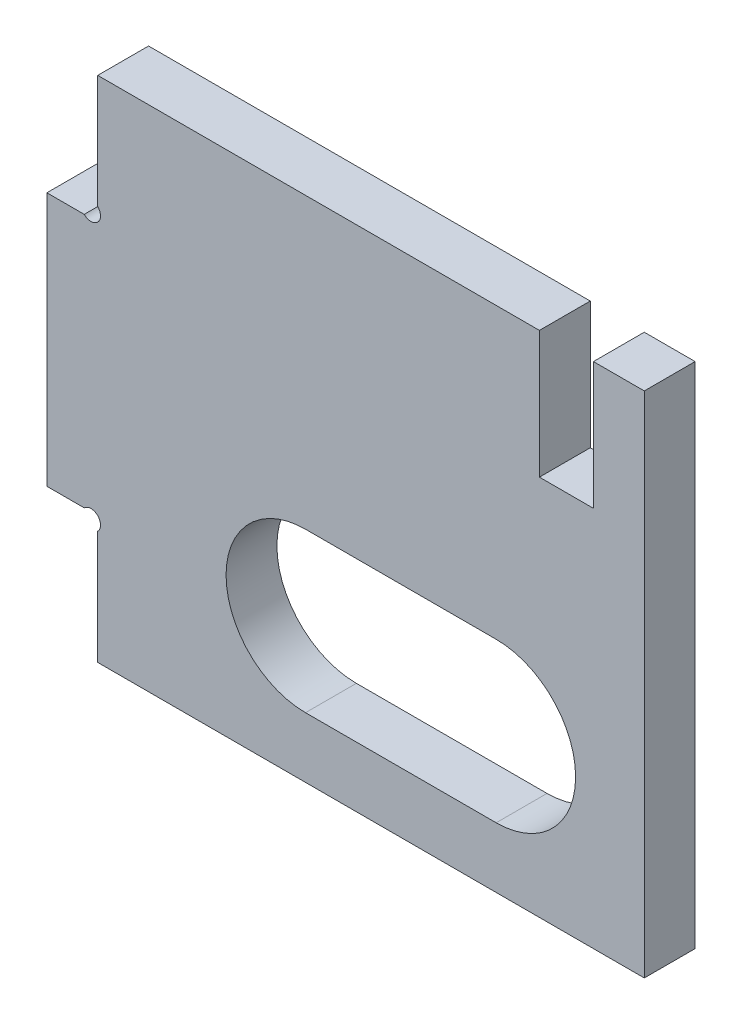
ISO-10303-21;
HEADER;
FILE_DESCRIPTION(('STEP AP214'),'2;1');
FILE_NAME('part.step','',(''),(''),'','','');
FILE_SCHEMA(('AUTOMOTIVE_DESIGN { 1 0 10303 214 1 1 1 1 }'));
ENDSEC;
DATA;
#1=APPLICATION_CONTEXT('core data for automotive mechanical design processes');
#2=APPLICATION_PROTOCOL_DEFINITION('international standard','automotive_design',2000,#1);
#3=PRODUCT_CONTEXT('',#1,'mechanical');
#4=PRODUCT('Part','Part','',(#3));
#5=PRODUCT_RELATED_PRODUCT_CATEGORY('part','',(#4));
#6=PRODUCT_DEFINITION_FORMATION('','',#4);
#7=PRODUCT_DEFINITION_CONTEXT('part definition',#1,'design');
#8=PRODUCT_DEFINITION('design','',#6,#7);
#9=PRODUCT_DEFINITION_SHAPE('','',#8);
#10=(LENGTH_UNIT() NAMED_UNIT(*) SI_UNIT(.MILLI.,.METRE.));
#11=(NAMED_UNIT(*) PLANE_ANGLE_UNIT() SI_UNIT($,.RADIAN.));
#12=(NAMED_UNIT(*) SI_UNIT($,.STERADIAN.) SOLID_ANGLE_UNIT());
#13=UNCERTAINTY_MEASURE_WITH_UNIT(LENGTH_MEASURE(1.E-05),#10,'distance_accuracy_value','');
#14=(GEOMETRIC_REPRESENTATION_CONTEXT(3) GLOBAL_UNCERTAINTY_ASSIGNED_CONTEXT((#13)) GLOBAL_UNIT_ASSIGNED_CONTEXT((#10,
#11,#12)) REPRESENTATION_CONTEXT('',''));
#15=CARTESIAN_POINT('',(0.,0.,0.));
#16=DIRECTION('',(0.,0.,1.));
#17=DIRECTION('',(1.,0.,0.));
#18=AXIS2_PLACEMENT_3D('',#15,#16,#17);
#19=CARTESIAN_POINT('',(-49.266922557395,51.6318844514959,8.));
#20=DIRECTION('',(0.,0.,1.));
#21=DIRECTION('',(1.,0.,0.));
#22=AXIS2_PLACEMENT_3D('',#19,#20,#21);
#23=PLANE('',#22);
#24=DIRECTION('',(-1.,0.,0.));
#25=VECTOR('',#24,1.);
#26=CARTESIAN_POINT('',(21.2937376143848,70.5712242797161,8.));
#27=LINE('',#26,#25);
#28=CARTESIAN_POINT('',(21.2937376143848,70.5712242797161,8.));
#29=VERTEX_POINT('',#28);
#30=CARTESIAN_POINT('',(-48.2062623856152,70.5712242797161,8.));
#31=VERTEX_POINT('',#30);
#32=EDGE_CURVE('E193',#29,#31,#27,.T.);
#33=ORIENTED_EDGE('',*,*,#32,.T.);
#34=DIRECTION('',(0.,-1.,0.));
#35=VECTOR('',#34,1.);
#36=CARTESIAN_POINT('',(-48.2062623856152,70.5712242797161,8.));
#37=LINE('',#36,#35);
#38=CARTESIAN_POINT('',(-48.2062623856152,52.6925446232758,8.));
#39=VERTEX_POINT('',#38);
#40=EDGE_CURVE('E196',#31,#39,#37,.T.);
#41=ORIENTED_EDGE('',*,*,#40,.T.);
#42=CARTESIAN_POINT('',(-49.266922557395,51.6318844514959,8.));
#43=DIRECTION('',(0.,0.,-1.));
#44=DIRECTION('',(1.,0.,0.));
#45=AXIS2_PLACEMENT_3D('',#42,#43,#44);
#46=CIRCLE('',#45,1.5);
#47=CARTESIAN_POINT('',(-50.3275827291749,50.5712242797161,8.));
#48=VERTEX_POINT('',#47);
#49=EDGE_CURVE('E199',#39,#48,#46,.T.);
#50=ORIENTED_EDGE('',*,*,#49,.T.);
#51=DIRECTION('',(-1.,0.,0.));
#52=VECTOR('',#51,1.);
#53=CARTESIAN_POINT('',(-50.3275827291749,50.5712242797161,8.));
#54=LINE('',#53,#52);
#55=CARTESIAN_POINT('',(-56.2062623856152,50.5712242797161,8.));
#56=VERTEX_POINT('',#55);
#57=EDGE_CURVE('E201',#48,#56,#54,.T.);
#58=ORIENTED_EDGE('',*,*,#57,.T.);
#59=DIRECTION('',(0.,-1.,0.));
#60=VECTOR('',#59,1.);
#61=CARTESIAN_POINT('',(-56.2062623856152,50.5712242797161,8.));
#62=LINE('',#61,#60);
#63=CARTESIAN_POINT('',(-56.2062623856152,10.5712242797161,8.));
#64=VERTEX_POINT('',#63);
#65=EDGE_CURVE('E203',#56,#64,#62,.T.);
#66=ORIENTED_EDGE('',*,*,#65,.T.);
#67=DIRECTION('',(1.,0.,0.));
#68=VECTOR('',#67,1.);
#69=CARTESIAN_POINT('',(-56.2062623856152,10.5712242797161,8.));
#70=LINE('',#69,#68);
#71=CARTESIAN_POINT('',(-50.3275827291748,10.5712242797161,8.));
#72=VERTEX_POINT('',#71);
#73=EDGE_CURVE('E205',#64,#72,#70,.T.);
#74=ORIENTED_EDGE('',*,*,#73,.T.);
#75=CARTESIAN_POINT('',(-49.266922557395,9.51056410793631,8.));
#76=DIRECTION('',(0.,0.,-1.));
#77=DIRECTION('',(1.,0.,0.));
#78=AXIS2_PLACEMENT_3D('',#75,#76,#77);
#79=CIRCLE('',#78,1.5);
#80=CARTESIAN_POINT('',(-48.2062623856152,8.44990393615645,8.));
#81=VERTEX_POINT('',#80);
#82=EDGE_CURVE('E207',#72,#81,#79,.T.);
#83=ORIENTED_EDGE('',*,*,#82,.T.);
#84=DIRECTION('',(0.,-1.,0.));
#85=VECTOR('',#84,1.);
#86=CARTESIAN_POINT('',(-48.2062623856152,8.44990393615646,8.));
#87=LINE('',#86,#85);
#88=CARTESIAN_POINT('',(-48.2062623856152,-9.42877572028391,8.));
#89=VERTEX_POINT('',#88);
#90=EDGE_CURVE('E209',#81,#89,#87,.T.);
#91=ORIENTED_EDGE('',*,*,#90,.T.);
#92=DIRECTION('',(1.,0.,0.));
#93=VECTOR('',#92,1.);
#94=CARTESIAN_POINT('',(-48.2062623856152,-9.42877572028391,8.));
#95=LINE('',#94,#93);
#96=CARTESIAN_POINT('',(37.7937376143848,-9.42877572028391,8.));
#97=VERTEX_POINT('',#96);
#98=EDGE_CURVE('E211',#89,#97,#95,.T.);
#99=ORIENTED_EDGE('',*,*,#98,.T.);
#100=DIRECTION('',(0.,1.,0.));
#101=VECTOR('',#100,1.);
#102=CARTESIAN_POINT('',(37.7937376143848,-9.42877572028391,8.));
#103=LINE('',#102,#101);
#104=CARTESIAN_POINT('',(37.7937376143848,70.5712242797161,8.));
#105=VERTEX_POINT('',#104);
#106=EDGE_CURVE('E213',#97,#105,#103,.T.);
#107=ORIENTED_EDGE('',*,*,#106,.T.);
#108=DIRECTION('',(-1.,0.,0.));
#109=VECTOR('',#108,1.);
#110=CARTESIAN_POINT('',(37.7937376143848,70.5712242797161,8.));
#111=LINE('',#110,#109);
#112=CARTESIAN_POINT('',(29.7937376143848,70.5712242797161,8.));
#113=VERTEX_POINT('',#112);
#114=EDGE_CURVE('E215',#105,#113,#111,.T.);
#115=ORIENTED_EDGE('',*,*,#114,.T.);
#116=DIRECTION('',(0.,-1.,0.));
#117=VECTOR('',#116,1.);
#118=CARTESIAN_POINT('',(29.7937376143848,70.5712242797161,8.));
#119=LINE('',#118,#117);
#120=CARTESIAN_POINT('',(29.7937376143848,50.5712242797161,8.));
#121=VERTEX_POINT('',#120);
#122=EDGE_CURVE('E217',#113,#121,#119,.T.);
#123=ORIENTED_EDGE('',*,*,#122,.T.);
#124=DIRECTION('',(-1.,0.,0.));
#125=VECTOR('',#124,1.);
#126=CARTESIAN_POINT('',(29.7937376143848,50.5712242797161,8.));
#127=LINE('',#126,#125);
#128=CARTESIAN_POINT('',(21.2937376143848,50.5712242797161,8.));
#129=VERTEX_POINT('',#128);
#130=EDGE_CURVE('E219',#121,#129,#127,.T.);
#131=ORIENTED_EDGE('',*,*,#130,.T.);
#132=DIRECTION('',(0.,1.,0.));
#133=VECTOR('',#132,1.);
#134=CARTESIAN_POINT('',(21.2937376143848,50.5712242797161,8.));
#135=LINE('',#134,#133);
#136=EDGE_CURVE('E221',#129,#29,#135,.T.);
#137=ORIENTED_EDGE('',*,*,#136,.T.);
#138=EDGE_LOOP('',(#33,#41,#50,#58,#66,#74,#83,#91,#99,#107,#115,#123,#131,#137));
#139=FACE_BOUND('',#138,.T.);
#140=DIRECTION('',(1.,0.,0.));
#141=VECTOR('',#140,1.);
#142=CARTESIAN_POINT('',(-15.511163156441,0.0712242797160818,8.));
#143=LINE('',#142,#141);
#144=CARTESIAN_POINT('',(-15.511163156441,0.0712242797160818,8.));
#145=VERTEX_POINT('',#144);
#146=CARTESIAN_POINT('',(14.488836843559,0.0712242797160957,8.));
#147=VERTEX_POINT('',#146);
#148=EDGE_CURVE('E165',#145,#147,#143,.T.);
#149=ORIENTED_EDGE('',*,*,#148,.F.);
#150=CARTESIAN_POINT('',(-15.511163156441,12.5712242797161,8.));
#151=DIRECTION('',(0.,0.,1.));
#152=DIRECTION('',(1.,0.,0.));
#153=AXIS2_PLACEMENT_3D('',#150,#151,#152);
#154=CIRCLE('',#153,12.5);
#155=CARTESIAN_POINT('',(-15.511163156441,25.0712242797161,8.));
#156=VERTEX_POINT('',#155);
#157=EDGE_CURVE('E157',#156,#145,#154,.T.);
#158=ORIENTED_EDGE('',*,*,#157,.F.);
#159=DIRECTION('',(-1.,0.,0.));
#160=VECTOR('',#159,1.);
#161=CARTESIAN_POINT('',(-15.511163156441,25.0712242797161,8.));
#162=LINE('',#161,#160);
#163=CARTESIAN_POINT('',(14.488836843559,25.0712242797161,8.));
#164=VERTEX_POINT('',#163);
#165=EDGE_CURVE('E179',#164,#156,#162,.T.);
#166=ORIENTED_EDGE('',*,*,#165,.F.);
#167=CARTESIAN_POINT('',(14.488836843559,12.5712242797161,8.));
#168=DIRECTION('',(0.,0.,1.));
#169=DIRECTION('',(1.,0.,0.));
#170=AXIS2_PLACEMENT_3D('',#167,#168,#169);
#171=CIRCLE('',#170,12.5);
#172=EDGE_CURVE('E177',#147,#164,#171,.T.);
#173=ORIENTED_EDGE('',*,*,#172,.F.);
#174=EDGE_LOOP('',(#149,#158,#166,#173));
#175=FACE_BOUND('',#174,.T.);
#176=ADVANCED_FACE('F32',(#139,#175),#23,.T.);
#177=CARTESIAN_POINT('',(-49.266922557395,51.6318844514959,0.));
#178=DIRECTION('',(0.,0.,1.));
#179=DIRECTION('',(1.,0.,0.));
#180=AXIS2_PLACEMENT_3D('',#177,#178,#179);
#181=PLANE('',#180);
#182=DIRECTION('',(-1.,0.,0.));
#183=VECTOR('',#182,1.);
#184=CARTESIAN_POINT('',(21.2937376143848,70.5712242797161,0.));
#185=LINE('',#184,#183);
#186=CARTESIAN_POINT('',(21.2937376143848,70.5712242797161,0.));
#187=VERTEX_POINT('',#186);
#188=CARTESIAN_POINT('',(-48.2062623856152,70.5712242797161,0.));
#189=VERTEX_POINT('',#188);
#190=EDGE_CURVE('E173',#187,#189,#185,.T.);
#191=ORIENTED_EDGE('',*,*,#190,.F.);
#192=DIRECTION('',(0.,1.,0.));
#193=VECTOR('',#192,1.);
#194=CARTESIAN_POINT('',(21.2937376143848,50.5712242797161,0.));
#195=LINE('',#194,#193);
#196=CARTESIAN_POINT('',(21.2937376143848,50.5712242797161,0.));
#197=VERTEX_POINT('',#196);
#198=EDGE_CURVE('E197',#197,#187,#195,.T.);
#199=ORIENTED_EDGE('',*,*,#198,.F.);
#200=DIRECTION('',(-1.,0.,0.));
#201=VECTOR('',#200,1.);
#202=CARTESIAN_POINT('',(29.7937376143848,50.5712242797161,0.));
#203=LINE('',#202,#201);
#204=CARTESIAN_POINT('',(29.7937376143848,50.5712242797161,0.));
#205=VERTEX_POINT('',#204);
#206=EDGE_CURVE('E248',#205,#197,#203,.T.);
#207=ORIENTED_EDGE('',*,*,#206,.F.);
#208=DIRECTION('',(0.,-1.,0.));
#209=VECTOR('',#208,1.);
#210=CARTESIAN_POINT('',(29.7937376143848,70.5712242797161,0.));
#211=LINE('',#210,#209);
#212=CARTESIAN_POINT('',(29.7937376143848,70.5712242797161,0.));
#213=VERTEX_POINT('',#212);
#214=EDGE_CURVE('E246',#213,#205,#211,.T.);
#215=ORIENTED_EDGE('',*,*,#214,.F.);
#216=DIRECTION('',(-1.,0.,0.));
#217=VECTOR('',#216,1.);
#218=CARTESIAN_POINT('',(37.7937376143848,70.5712242797161,0.));
#219=LINE('',#218,#217);
#220=CARTESIAN_POINT('',(37.7937376143848,70.5712242797161,0.));
#221=VERTEX_POINT('',#220);
#222=EDGE_CURVE('E244',#221,#213,#219,.T.);
#223=ORIENTED_EDGE('',*,*,#222,.F.);
#224=DIRECTION('',(0.,1.,0.));
#225=VECTOR('',#224,1.);
#226=CARTESIAN_POINT('',(37.7937376143848,-9.42877572028391,0.));
#227=LINE('',#226,#225);
#228=CARTESIAN_POINT('',(37.7937376143848,-9.42877572028391,0.));
#229=VERTEX_POINT('',#228);
#230=EDGE_CURVE('E242',#229,#221,#227,.T.);
#231=ORIENTED_EDGE('',*,*,#230,.F.);
#232=DIRECTION('',(1.,0.,0.));
#233=VECTOR('',#232,1.);
#234=CARTESIAN_POINT('',(-48.2062623856152,-9.42877572028391,0.));
#235=LINE('',#234,#233);
#236=CARTESIAN_POINT('',(-48.2062623856152,-9.42877572028391,0.));
#237=VERTEX_POINT('',#236);
#238=EDGE_CURVE('E240',#237,#229,#235,.T.);
#239=ORIENTED_EDGE('',*,*,#238,.F.);
#240=DIRECTION('',(0.,-1.,0.));
#241=VECTOR('',#240,1.);
#242=CARTESIAN_POINT('',(-48.2062623856152,8.44990393615646,0.));
#243=LINE('',#242,#241);
#244=CARTESIAN_POINT('',(-48.2062623856152,8.44990393615645,0.));
#245=VERTEX_POINT('',#244);
#246=EDGE_CURVE('E238',#245,#237,#243,.T.);
#247=ORIENTED_EDGE('',*,*,#246,.F.);
#248=CARTESIAN_POINT('',(-49.266922557395,9.51056410793631,0.));
#249=DIRECTION('',(0.,0.,-1.));
#250=DIRECTION('',(1.,0.,0.));
#251=AXIS2_PLACEMENT_3D('',#248,#249,#250);
#252=CIRCLE('',#251,1.5);
#253=CARTESIAN_POINT('',(-50.3275827291748,10.5712242797161,0.));
#254=VERTEX_POINT('',#253);
#255=EDGE_CURVE('E236',#254,#245,#252,.T.);
#256=ORIENTED_EDGE('',*,*,#255,.F.);
#257=DIRECTION('',(1.,0.,0.));
#258=VECTOR('',#257,1.);
#259=CARTESIAN_POINT('',(-56.2062623856152,10.5712242797161,0.));
#260=LINE('',#259,#258);
#261=CARTESIAN_POINT('',(-56.2062623856152,10.5712242797161,0.));
#262=VERTEX_POINT('',#261);
#263=EDGE_CURVE('E234',#262,#254,#260,.T.);
#264=ORIENTED_EDGE('',*,*,#263,.F.);
#265=DIRECTION('',(0.,-1.,0.));
#266=VECTOR('',#265,1.);
#267=CARTESIAN_POINT('',(-56.2062623856152,50.5712242797161,0.));
#268=LINE('',#267,#266);
#269=CARTESIAN_POINT('',(-56.2062623856152,50.5712242797161,0.));
#270=VERTEX_POINT('',#269);
#271=EDGE_CURVE('E232',#270,#262,#268,.T.);
#272=ORIENTED_EDGE('',*,*,#271,.F.);
#273=DIRECTION('',(-1.,0.,0.));
#274=VECTOR('',#273,1.);
#275=CARTESIAN_POINT('',(-50.3275827291749,50.5712242797161,0.));
#276=LINE('',#275,#274);
#277=CARTESIAN_POINT('',(-50.3275827291749,50.5712242797161,0.));
#278=VERTEX_POINT('',#277);
#279=EDGE_CURVE('E230',#278,#270,#276,.T.);
#280=ORIENTED_EDGE('',*,*,#279,.F.);
#281=CARTESIAN_POINT('',(-49.266922557395,51.6318844514959,0.));
#282=DIRECTION('',(0.,0.,-1.));
#283=DIRECTION('',(1.,0.,0.));
#284=AXIS2_PLACEMENT_3D('',#281,#282,#283);
#285=CIRCLE('',#284,1.5);
#286=CARTESIAN_POINT('',(-48.2062623856152,52.6925446232758,0.));
#287=VERTEX_POINT('',#286);
#288=EDGE_CURVE('E228',#287,#278,#285,.T.);
#289=ORIENTED_EDGE('',*,*,#288,.F.);
#290=DIRECTION('',(0.,-1.,0.));
#291=VECTOR('',#290,1.);
#292=CARTESIAN_POINT('',(-48.2062623856152,70.5712242797161,0.));
#293=LINE('',#292,#291);
#294=EDGE_CURVE('E226',#189,#287,#293,.T.);
#295=ORIENTED_EDGE('',*,*,#294,.F.);
#296=EDGE_LOOP('',(#191,#199,#207,#215,#223,#231,#239,#247,#256,#264,#272,#280,#289,#295));
#297=FACE_BOUND('',#296,.T.);
#298=CARTESIAN_POINT('',(-15.511163156441,12.5712242797161,0.));
#299=DIRECTION('',(0.,0.,1.));
#300=DIRECTION('',(1.,0.,0.));
#301=AXIS2_PLACEMENT_3D('',#298,#299,#300);
#302=CIRCLE('',#301,12.5);
#303=CARTESIAN_POINT('',(-15.511163156441,25.0712242797161,0.));
#304=VERTEX_POINT('',#303);
#305=CARTESIAN_POINT('',(-15.511163156441,0.0712242797160818,0.));
#306=VERTEX_POINT('',#305);
#307=EDGE_CURVE('E55',#304,#306,#302,.T.);
#308=ORIENTED_EDGE('',*,*,#307,.T.);
#309=DIRECTION('',(1.,0.,0.));
#310=VECTOR('',#309,1.);
#311=CARTESIAN_POINT('',(-15.511163156441,0.0712242797160818,0.));
#312=LINE('',#311,#310);
#313=CARTESIAN_POINT('',(14.488836843559,0.0712242797160957,0.));
#314=VERTEX_POINT('',#313);
#315=EDGE_CURVE('E172',#306,#314,#312,.T.);
#316=ORIENTED_EDGE('',*,*,#315,.T.);
#317=CARTESIAN_POINT('',(14.488836843559,12.5712242797161,0.));
#318=DIRECTION('',(0.,0.,1.));
#319=DIRECTION('',(1.,0.,0.));
#320=AXIS2_PLACEMENT_3D('',#317,#318,#319);
#321=CIRCLE('',#320,12.5);
#322=CARTESIAN_POINT('',(14.488836843559,25.0712242797161,0.));
#323=VERTEX_POINT('',#322);
#324=EDGE_CURVE('E185',#314,#323,#321,.T.);
#325=ORIENTED_EDGE('',*,*,#324,.T.);
#326=DIRECTION('',(-1.,0.,0.));
#327=VECTOR('',#326,1.);
#328=CARTESIAN_POINT('',(-15.511163156441,25.0712242797161,0.));
#329=LINE('',#328,#327);
#330=EDGE_CURVE('E166',#323,#304,#329,.T.);
#331=ORIENTED_EDGE('',*,*,#330,.T.);
#332=EDGE_LOOP('',(#308,#316,#325,#331));
#333=FACE_BOUND('',#332,.T.);
#334=ADVANCED_FACE('F296',(#297,#333),#181,.F.);
#335=CARTESIAN_POINT('',(21.2937376143848,70.5712242797161,8.));
#336=DIRECTION('',(0.,-1.,0.));
#337=DIRECTION('',(1.,0.,0.));
#338=AXIS2_PLACEMENT_3D('',#335,#336,#337);
#339=PLANE('',#338);
#340=ORIENTED_EDGE('',*,*,#190,.T.);
#341=DIRECTION('',(0.,0.,-1.));
#342=VECTOR('',#341,1.);
#343=CARTESIAN_POINT('',(-48.2062623856152,70.5712242797161,8.));
#344=LINE('',#343,#342);
#345=EDGE_CURVE('E11',#31,#189,#344,.T.);
#346=ORIENTED_EDGE('',*,*,#345,.F.);
#347=ORIENTED_EDGE('',*,*,#32,.F.);
#348=DIRECTION('',(0.,0.,-1.));
#349=VECTOR('',#348,1.);
#350=CARTESIAN_POINT('',(21.2937376143848,70.5712242797161,8.));
#351=LINE('',#350,#349);
#352=EDGE_CURVE('E223',#29,#187,#351,.T.);
#353=ORIENTED_EDGE('',*,*,#352,.T.);
#354=EDGE_LOOP('',(#340,#346,#347,#353));
#355=FACE_BOUND('',#354,.T.);
#356=ADVANCED_FACE('F34',(#355),#339,.F.);
#357=CARTESIAN_POINT('',(-48.2062623856152,70.5712242797161,8.));
#358=DIRECTION('',(1.,0.,0.));
#359=DIRECTION('',(0.,1.,0.));
#360=AXIS2_PLACEMENT_3D('',#357,#358,#359);
#361=PLANE('',#360);
#362=ORIENTED_EDGE('',*,*,#294,.T.);
#363=DIRECTION('',(0.,0.,-1.));
#364=VECTOR('',#363,1.);
#365=CARTESIAN_POINT('',(-48.2062623856152,52.6925446232758,8.));
#366=LINE('',#365,#364);
#367=EDGE_CURVE('E40',#39,#287,#366,.T.);
#368=ORIENTED_EDGE('',*,*,#367,.F.);
#369=ORIENTED_EDGE('',*,*,#40,.F.);
#370=ORIENTED_EDGE('',*,*,#345,.T.);
#371=EDGE_LOOP('',(#362,#368,#369,#370));
#372=FACE_BOUND('',#371,.T.);
#373=ADVANCED_FACE('F313',(#372),#361,.F.);
#374=CARTESIAN_POINT('',(-49.266922557395,51.6318844514959,8.));
#375=DIRECTION('',(0.,0.,-1.));
#376=DIRECTION('',(-1.,0.,0.));
#377=AXIS2_PLACEMENT_3D('',#374,#375,#376);
#378=CYLINDRICAL_SURFACE('',#377,1.5);
#379=ORIENTED_EDGE('',*,*,#288,.T.);
#380=DIRECTION('',(0.,0.,-1.));
#381=VECTOR('',#380,1.);
#382=CARTESIAN_POINT('',(-50.3275827291749,50.5712242797161,8.));
#383=LINE('',#382,#381);
#384=EDGE_CURVE('E283',#48,#278,#383,.T.);
#385=ORIENTED_EDGE('',*,*,#384,.F.);
#386=ORIENTED_EDGE('',*,*,#49,.F.);
#387=ORIENTED_EDGE('',*,*,#367,.T.);
#388=EDGE_LOOP('',(#379,#385,#386,#387));
#389=FACE_BOUND('',#388,.T.);
#390=ADVANCED_FACE('F290',(#389),#378,.F.);
#391=CARTESIAN_POINT('',(-50.3275827291749,50.5712242797161,8.));
#392=DIRECTION('',(0.,-1.,0.));
#393=DIRECTION('',(0.,0.,-1.));
#394=AXIS2_PLACEMENT_3D('',#391,#392,#393);
#395=PLANE('',#394);
#396=ORIENTED_EDGE('',*,*,#279,.T.);
#397=DIRECTION('',(0.,0.,-1.));
#398=VECTOR('',#397,1.);
#399=CARTESIAN_POINT('',(-56.2062623856152,50.5712242797161,8.));
#400=LINE('',#399,#398);
#401=EDGE_CURVE('E280',#56,#270,#400,.T.);
#402=ORIENTED_EDGE('',*,*,#401,.F.);
#403=ORIENTED_EDGE('',*,*,#57,.F.);
#404=ORIENTED_EDGE('',*,*,#384,.T.);
#405=EDGE_LOOP('',(#396,#402,#403,#404));
#406=FACE_BOUND('',#405,.T.);
#407=ADVANCED_FACE('F302',(#406),#395,.F.);
#408=CARTESIAN_POINT('',(-56.2062623856152,50.5712242797161,8.));
#409=DIRECTION('',(1.,0.,0.));
#410=DIRECTION('',(0.,1.,0.));
#411=AXIS2_PLACEMENT_3D('',#408,#409,#410);
#412=PLANE('',#411);
#413=ORIENTED_EDGE('',*,*,#271,.T.);
#414=DIRECTION('',(0.,0.,-1.));
#415=VECTOR('',#414,1.);
#416=CARTESIAN_POINT('',(-56.2062623856152,10.5712242797161,8.));
#417=LINE('',#416,#415);
#418=EDGE_CURVE('E277',#64,#262,#417,.T.);
#419=ORIENTED_EDGE('',*,*,#418,.F.);
#420=ORIENTED_EDGE('',*,*,#65,.F.);
#421=ORIENTED_EDGE('',*,*,#401,.T.);
#422=EDGE_LOOP('',(#413,#419,#420,#421));
#423=FACE_BOUND('',#422,.T.);
#424=ADVANCED_FACE('F306',(#423),#412,.F.);
#425=CARTESIAN_POINT('',(-56.2062623856152,10.5712242797161,8.));
#426=DIRECTION('',(0.,1.,0.));
#427=DIRECTION('',(0.,0.,1.));
#428=AXIS2_PLACEMENT_3D('',#425,#426,#427);
#429=PLANE('',#428);
#430=ORIENTED_EDGE('',*,*,#263,.T.);
#431=DIRECTION('',(0.,0.,-1.));
#432=VECTOR('',#431,1.);
#433=CARTESIAN_POINT('',(-50.3275827291748,10.5712242797161,8.));
#434=LINE('',#433,#432);
#435=EDGE_CURVE('E274',#72,#254,#434,.T.);
#436=ORIENTED_EDGE('',*,*,#435,.F.);
#437=ORIENTED_EDGE('',*,*,#73,.F.);
#438=ORIENTED_EDGE('',*,*,#418,.T.);
#439=EDGE_LOOP('',(#430,#436,#437,#438));
#440=FACE_BOUND('',#439,.T.);
#441=ADVANCED_FACE('F356',(#440),#429,.F.);
#442=CARTESIAN_POINT('',(-49.266922557395,9.51056410793631,8.));
#443=DIRECTION('',(0.,0.,-1.));
#444=DIRECTION('',(-1.,0.,0.));
#445=AXIS2_PLACEMENT_3D('',#442,#443,#444);
#446=CYLINDRICAL_SURFACE('',#445,1.5);
#447=ORIENTED_EDGE('',*,*,#255,.T.);
#448=DIRECTION('',(0.,0.,-1.));
#449=VECTOR('',#448,1.);
#450=CARTESIAN_POINT('',(-48.2062623856152,8.44990393615645,8.));
#451=LINE('',#450,#449);
#452=EDGE_CURVE('E271',#81,#245,#451,.T.);
#453=ORIENTED_EDGE('',*,*,#452,.F.);
#454=ORIENTED_EDGE('',*,*,#82,.F.);
#455=ORIENTED_EDGE('',*,*,#435,.T.);
#456=EDGE_LOOP('',(#447,#453,#454,#455));
#457=FACE_BOUND('',#456,.T.);
#458=ADVANCED_FACE('F354',(#457),#446,.F.);
#459=CARTESIAN_POINT('',(-48.2062623856152,8.44990393615646,8.));
#460=DIRECTION('',(1.,0.,0.));
#461=DIRECTION('',(0.,0.,-1.));
#462=AXIS2_PLACEMENT_3D('',#459,#460,#461);
#463=PLANE('',#462);
#464=ORIENTED_EDGE('',*,*,#246,.T.);
#465=DIRECTION('',(0.,0.,-1.));
#466=VECTOR('',#465,1.);
#467=CARTESIAN_POINT('',(-48.2062623856152,-9.42877572028391,8.));
#468=LINE('',#467,#466);
#469=EDGE_CURVE('E268',#89,#237,#468,.T.);
#470=ORIENTED_EDGE('',*,*,#469,.F.);
#471=ORIENTED_EDGE('',*,*,#90,.F.);
#472=ORIENTED_EDGE('',*,*,#452,.T.);
#473=EDGE_LOOP('',(#464,#470,#471,#472));
#474=FACE_BOUND('',#473,.T.);
#475=ADVANCED_FACE('F349',(#474),#463,.F.);
#476=CARTESIAN_POINT('',(-48.2062623856152,-9.42877572028391,8.));
#477=DIRECTION('',(0.,1.,0.));
#478=DIRECTION('',(0.,0.,1.));
#479=AXIS2_PLACEMENT_3D('',#476,#477,#478);
#480=PLANE('',#479);
#481=ORIENTED_EDGE('',*,*,#238,.T.);
#482=DIRECTION('',(0.,0.,-1.));
#483=VECTOR('',#482,1.);
#484=CARTESIAN_POINT('',(37.7937376143848,-9.42877572028391,8.));
#485=LINE('',#484,#483);
#486=EDGE_CURVE('E265',#97,#229,#485,.T.);
#487=ORIENTED_EDGE('',*,*,#486,.F.);
#488=ORIENTED_EDGE('',*,*,#98,.F.);
#489=ORIENTED_EDGE('',*,*,#469,.T.);
#490=EDGE_LOOP('',(#481,#487,#488,#489));
#491=FACE_BOUND('',#490,.T.);
#492=ADVANCED_FACE('F344',(#491),#480,.F.);
#493=CARTESIAN_POINT('',(37.7937376143848,-9.42877572028391,8.));
#494=DIRECTION('',(-1.,0.,0.));
#495=DIRECTION('',(0.,0.,1.));
#496=AXIS2_PLACEMENT_3D('',#493,#494,#495);
#497=PLANE('',#496);
#498=ORIENTED_EDGE('',*,*,#230,.T.);
#499=DIRECTION('',(0.,0.,-1.));
#500=VECTOR('',#499,1.);
#501=CARTESIAN_POINT('',(37.7937376143848,70.5712242797161,8.));
#502=LINE('',#501,#500);
#503=EDGE_CURVE('E262',#105,#221,#502,.T.);
#504=ORIENTED_EDGE('',*,*,#503,.F.);
#505=ORIENTED_EDGE('',*,*,#106,.F.);
#506=ORIENTED_EDGE('',*,*,#486,.T.);
#507=EDGE_LOOP('',(#498,#504,#505,#506));
#508=FACE_BOUND('',#507,.T.);
#509=ADVANCED_FACE('F340',(#508),#497,.F.);
#510=CARTESIAN_POINT('',(37.7937376143848,70.5712242797161,8.));
#511=DIRECTION('',(0.,-1.,0.));
#512=DIRECTION('',(1.,0.,0.));
#513=AXIS2_PLACEMENT_3D('',#510,#511,#512);
#514=PLANE('',#513);
#515=ORIENTED_EDGE('',*,*,#222,.T.);
#516=DIRECTION('',(0.,0.,-1.));
#517=VECTOR('',#516,1.);
#518=CARTESIAN_POINT('',(29.7937376143848,70.5712242797161,8.));
#519=LINE('',#518,#517);
#520=EDGE_CURVE('E259',#113,#213,#519,.T.);
#521=ORIENTED_EDGE('',*,*,#520,.F.);
#522=ORIENTED_EDGE('',*,*,#114,.F.);
#523=ORIENTED_EDGE('',*,*,#503,.T.);
#524=EDGE_LOOP('',(#515,#521,#522,#523));
#525=FACE_BOUND('',#524,.T.);
#526=ADVANCED_FACE('F335',(#525),#514,.F.);
#527=CARTESIAN_POINT('',(29.7937376143848,70.5712242797161,8.));
#528=DIRECTION('',(1.,0.,0.));
#529=DIRECTION('',(0.,1.,0.));
#530=AXIS2_PLACEMENT_3D('',#527,#528,#529);
#531=PLANE('',#530);
#532=ORIENTED_EDGE('',*,*,#214,.T.);
#533=DIRECTION('',(0.,0.,-1.));
#534=VECTOR('',#533,1.);
#535=CARTESIAN_POINT('',(29.7937376143848,50.5712242797161,8.));
#536=LINE('',#535,#534);
#537=EDGE_CURVE('E256',#121,#205,#536,.T.);
#538=ORIENTED_EDGE('',*,*,#537,.F.);
#539=ORIENTED_EDGE('',*,*,#122,.F.);
#540=ORIENTED_EDGE('',*,*,#520,.T.);
#541=EDGE_LOOP('',(#532,#538,#539,#540));
#542=FACE_BOUND('',#541,.T.);
#543=ADVANCED_FACE('F329',(#542),#531,.F.);
#544=CARTESIAN_POINT('',(29.7937376143848,50.5712242797161,8.));
#545=DIRECTION('',(0.,-1.,0.));
#546=DIRECTION('',(1.,0.,0.));
#547=AXIS2_PLACEMENT_3D('',#544,#545,#546);
#548=PLANE('',#547);
#549=ORIENTED_EDGE('',*,*,#206,.T.);
#550=DIRECTION('',(0.,0.,-1.));
#551=VECTOR('',#550,1.);
#552=CARTESIAN_POINT('',(21.2937376143848,50.5712242797161,8.));
#553=LINE('',#552,#551);
#554=EDGE_CURVE('E253',#129,#197,#553,.T.);
#555=ORIENTED_EDGE('',*,*,#554,.F.);
#556=ORIENTED_EDGE('',*,*,#130,.F.);
#557=ORIENTED_EDGE('',*,*,#537,.T.);
#558=EDGE_LOOP('',(#549,#555,#556,#557));
#559=FACE_BOUND('',#558,.T.);
#560=ADVANCED_FACE('F325',(#559),#548,.F.);
#561=CARTESIAN_POINT('',(21.2937376143848,50.5712242797161,8.));
#562=DIRECTION('',(-1.,0.,0.));
#563=DIRECTION('',(0.,0.,1.));
#564=AXIS2_PLACEMENT_3D('',#561,#562,#563);
#565=PLANE('',#564);
#566=ORIENTED_EDGE('',*,*,#198,.T.);
#567=ORIENTED_EDGE('',*,*,#352,.F.);
#568=ORIENTED_EDGE('',*,*,#136,.F.);
#569=ORIENTED_EDGE('',*,*,#554,.T.);
#570=EDGE_LOOP('',(#566,#567,#568,#569));
#571=FACE_BOUND('',#570,.T.);
#572=ADVANCED_FACE('F320',(#571),#565,.F.);
#573=CARTESIAN_POINT('',(-15.511163156441,12.5712242797161,8.));
#574=DIRECTION('',(0.,0.,-1.));
#575=DIRECTION('',(-1.,0.,0.));
#576=AXIS2_PLACEMENT_3D('',#573,#574,#575);
#577=CYLINDRICAL_SURFACE('',#576,12.5);
#578=ORIENTED_EDGE('',*,*,#307,.F.);
#579=DIRECTION('',(0.,0.,-1.));
#580=VECTOR('',#579,1.);
#581=CARTESIAN_POINT('',(-15.511163156441,25.0712242797161,8.));
#582=LINE('',#581,#580);
#583=EDGE_CURVE('E161',#156,#304,#582,.T.);
#584=ORIENTED_EDGE('',*,*,#583,.F.);
#585=ORIENTED_EDGE('',*,*,#157,.T.);
#586=DIRECTION('',(0.,0.,-1.));
#587=VECTOR('',#586,1.);
#588=CARTESIAN_POINT('',(-15.511163156441,0.0712242797160818,8.));
#589=LINE('',#588,#587);
#590=EDGE_CURVE('E160',#145,#306,#589,.T.);
#591=ORIENTED_EDGE('',*,*,#590,.T.);
#592=EDGE_LOOP('',(#578,#584,#585,#591));
#593=FACE_BOUND('',#592,.T.);
#594=ADVANCED_FACE('F159',(#593),#577,.F.);
#595=CARTESIAN_POINT('',(-15.511163156441,0.0712242797160818,8.));
#596=DIRECTION('',(0.,1.,0.));
#597=DIRECTION('',(-1.,0.,0.));
#598=AXIS2_PLACEMENT_3D('',#595,#596,#597);
#599=PLANE('',#598);
#600=ORIENTED_EDGE('',*,*,#315,.F.);
#601=ORIENTED_EDGE('',*,*,#590,.F.);
#602=ORIENTED_EDGE('',*,*,#148,.T.);
#603=DIRECTION('',(0.,0.,-1.));
#604=VECTOR('',#603,1.);
#605=CARTESIAN_POINT('',(14.488836843559,0.0712242797160957,8.));
#606=LINE('',#605,#604);
#607=EDGE_CURVE('E174',#147,#314,#606,.T.);
#608=ORIENTED_EDGE('',*,*,#607,.T.);
#609=EDGE_LOOP('',(#600,#601,#602,#608));
#610=FACE_BOUND('',#609,.T.);
#611=ADVANCED_FACE('F169',(#610),#599,.T.);
#612=CARTESIAN_POINT('',(14.488836843559,12.5712242797161,8.));
#613=DIRECTION('',(0.,0.,-1.));
#614=DIRECTION('',(-1.,0.,0.));
#615=AXIS2_PLACEMENT_3D('',#612,#613,#614);
#616=CYLINDRICAL_SURFACE('',#615,12.5);
#617=ORIENTED_EDGE('',*,*,#324,.F.);
#618=ORIENTED_EDGE('',*,*,#607,.F.);
#619=ORIENTED_EDGE('',*,*,#172,.T.);
#620=DIRECTION('',(0.,0.,-1.));
#621=VECTOR('',#620,1.);
#622=CARTESIAN_POINT('',(14.488836843559,25.0712242797161,8.));
#623=LINE('',#622,#621);
#624=EDGE_CURVE('E47',#164,#323,#623,.T.);
#625=ORIENTED_EDGE('',*,*,#624,.T.);
#626=EDGE_LOOP('',(#617,#618,#619,#625));
#627=FACE_BOUND('',#626,.T.);
#628=ADVANCED_FACE('F426',(#627),#616,.F.);
#629=CARTESIAN_POINT('',(-15.511163156441,25.0712242797161,8.));
#630=DIRECTION('',(0.,-1.,0.));
#631=DIRECTION('',(1.,0.,0.));
#632=AXIS2_PLACEMENT_3D('',#629,#630,#631);
#633=PLANE('',#632);
#634=ORIENTED_EDGE('',*,*,#330,.F.);
#635=ORIENTED_EDGE('',*,*,#624,.F.);
#636=ORIENTED_EDGE('',*,*,#165,.T.);
#637=ORIENTED_EDGE('',*,*,#583,.T.);
#638=EDGE_LOOP('',(#634,#635,#636,#637));
#639=FACE_BOUND('',#638,.T.);
#640=ADVANCED_FACE('F432',(#639),#633,.T.);
#641=CLOSED_SHELL('',(#176,#334,#356,#373,#390,#407,#424,#441,#458,#475,#492,#509,#526,#543,
#560,#572,#594,#611,#628,#640));
#642=MANIFOLD_SOLID_BREP('B2',#641);
#643=ADVANCED_BREP_SHAPE_REPRESENTATION('',(#18,#642),#14);
#644=SHAPE_DEFINITION_REPRESENTATION(#9,#643);
ENDSEC;
END-ISO-10303-21;
